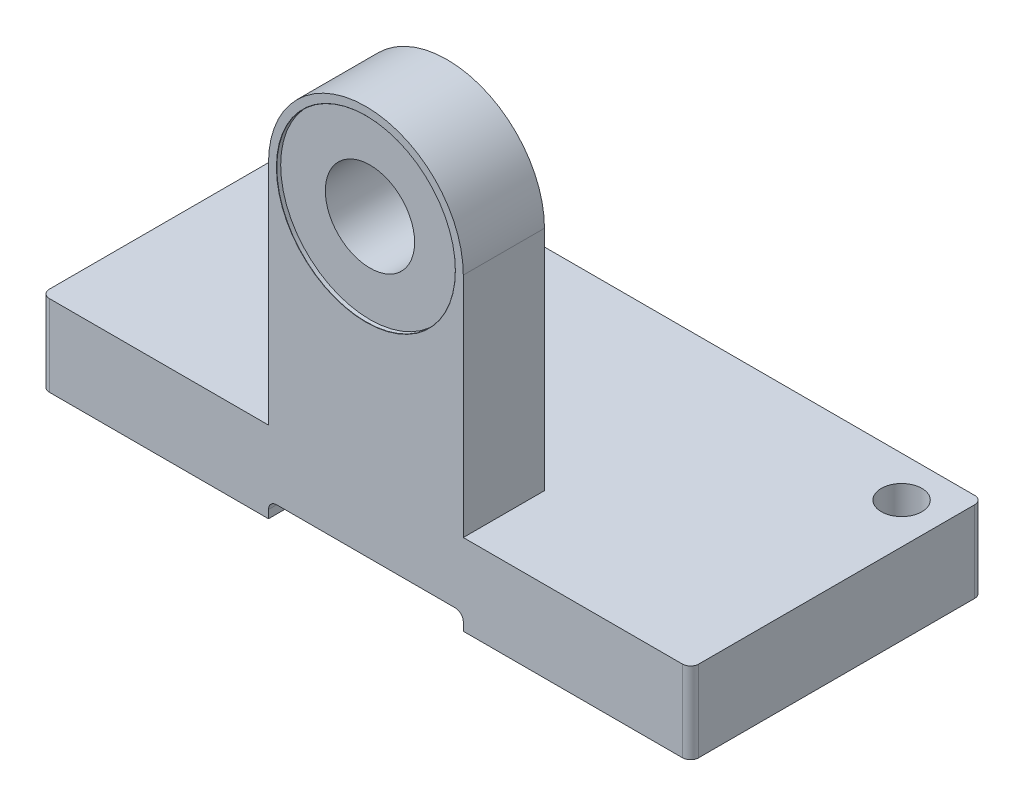
ISO-10303-21;
HEADER;
FILE_DESCRIPTION(('STEP AP214'),'2;1');
FILE_NAME('part.step','',(''),(''),'','','');
FILE_SCHEMA(('AUTOMOTIVE_DESIGN { 1 0 10303 214 1 1 1 1 }'));
ENDSEC;
DATA;
#1=APPLICATION_CONTEXT('core data for automotive mechanical design processes');
#2=APPLICATION_PROTOCOL_DEFINITION('international standard','automotive_design',2000,#1);
#3=PRODUCT_CONTEXT('',#1,'mechanical');
#4=PRODUCT('Part','Part','',(#3));
#5=PRODUCT_RELATED_PRODUCT_CATEGORY('part','',(#4));
#6=PRODUCT_DEFINITION_FORMATION('','',#4);
#7=PRODUCT_DEFINITION_CONTEXT('part definition',#1,'design');
#8=PRODUCT_DEFINITION('design','',#6,#7);
#9=PRODUCT_DEFINITION_SHAPE('','',#8);
#10=(LENGTH_UNIT() NAMED_UNIT(*) SI_UNIT(.MILLI.,.METRE.));
#11=(NAMED_UNIT(*) PLANE_ANGLE_UNIT() SI_UNIT($,.RADIAN.));
#12=(NAMED_UNIT(*) SI_UNIT($,.STERADIAN.) SOLID_ANGLE_UNIT());
#13=UNCERTAINTY_MEASURE_WITH_UNIT(LENGTH_MEASURE(1.E-05),#10,'distance_accuracy_value','');
#14=(GEOMETRIC_REPRESENTATION_CONTEXT(3) GLOBAL_UNCERTAINTY_ASSIGNED_CONTEXT((#13)) GLOBAL_UNIT_ASSIGNED_CONTEXT((#10,
#11,#12)) REPRESENTATION_CONTEXT('',''));
#15=CARTESIAN_POINT('',(0.,0.,0.));
#16=DIRECTION('',(0.,0.,1.));
#17=DIRECTION('',(1.,0.,0.));
#18=AXIS2_PLACEMENT_3D('',#15,#16,#17);
#19=CARTESIAN_POINT('',(0.,-10.,-36.));
#20=DIRECTION('',(0.,-1.,0.));
#21=DIRECTION('',(0.,0.,-1.));
#22=AXIS2_PLACEMENT_3D('',#19,#20,#21);
#23=PLANE('',#22);
#24=CARTESIAN_POINT('',(5.,-10.,-31.));
#25=DIRECTION('',(0.,1.,0.));
#26=DIRECTION('',(0.,0.,1.));
#27=AXIS2_PLACEMENT_3D('',#24,#25,#26);
#28=CIRCLE('',#27,2.5);
#29=CARTESIAN_POINT('',(5.,-10.,-28.5));
#30=VERTEX_POINT('',#29);
#31=EDGE_CURVE('E470',#30,#30,#28,.T.);
#32=ORIENTED_EDGE('',*,*,#31,.T.);
#33=EDGE_LOOP('',(#32));
#34=FACE_BOUND('',#33,.T.);
#35=DIRECTION('',(0.,0.,1.));
#36=VECTOR('',#35,1.);
#37=CARTESIAN_POINT('',(0.,-10.,-36.));
#38=LINE('',#37,#36);
#39=CARTESIAN_POINT('',(0.,-10.,-35.));
#40=VERTEX_POINT('',#39);
#41=CARTESIAN_POINT('',(0.,-10.,-1.));
#42=VERTEX_POINT('',#41);
#43=EDGE_CURVE('E238',#40,#42,#38,.T.);
#44=ORIENTED_EDGE('',*,*,#43,.F.);
#45=CARTESIAN_POINT('',(1.,-10.,-35.));
#46=DIRECTION('',(0.,-1.,0.));
#47=DIRECTION('',(0.,0.,-1.));
#48=AXIS2_PLACEMENT_3D('',#45,#46,#47);
#49=CIRCLE('',#48,1.);
#50=CARTESIAN_POINT('',(1.,-10.,-36.));
#51=VERTEX_POINT('',#50);
#52=EDGE_CURVE('E190',#40,#51,#49,.T.);
#53=ORIENTED_EDGE('',*,*,#52,.T.);
#54=DIRECTION('',(1.,0.,0.));
#55=VECTOR('',#54,1.);
#56=CARTESIAN_POINT('',(0.,-10.,-36.));
#57=LINE('',#56,#55);
#58=CARTESIAN_POINT('',(28.,-10.,-36.));
#59=VERTEX_POINT('',#58);
#60=EDGE_CURVE('E172',#51,#59,#57,.T.);
#61=ORIENTED_EDGE('',*,*,#60,.T.);
#62=DIRECTION('',(0.,0.,1.));
#63=VECTOR('',#62,1.);
#64=CARTESIAN_POINT('',(28.,-10.,-36.));
#65=LINE('',#64,#63);
#66=CARTESIAN_POINT('',(28.,-10.,0.));
#67=VERTEX_POINT('',#66);
#68=EDGE_CURVE('E189',#59,#67,#65,.T.);
#69=ORIENTED_EDGE('',*,*,#68,.T.);
#70=DIRECTION('',(1.,0.,0.));
#71=VECTOR('',#70,1.);
#72=CARTESIAN_POINT('',(0.,-10.,0.));
#73=LINE('',#72,#71);
#74=CARTESIAN_POINT('',(1.,-10.,0.));
#75=VERTEX_POINT('',#74);
#76=EDGE_CURVE('E239',#75,#67,#73,.T.);
#77=ORIENTED_EDGE('',*,*,#76,.F.);
#78=CARTESIAN_POINT('',(1.,-10.,-1.));
#79=DIRECTION('',(0.,-1.,0.));
#80=DIRECTION('',(0.,0.,-1.));
#81=AXIS2_PLACEMENT_3D('',#78,#79,#80);
#82=CIRCLE('',#81,1.);
#83=EDGE_CURVE('E287',#75,#42,#82,.T.);
#84=ORIENTED_EDGE('',*,*,#83,.T.);
#85=EDGE_LOOP('',(#44,#53,#61,#69,#77,#84));
#86=FACE_BOUND('',#85,.T.);
#87=ADVANCED_FACE('F45',(#34,#86),#23,.T.);
#88=CARTESIAN_POINT('',(40.,28.,-10.));
#89=DIRECTION('',(0.,0.,1.));
#90=DIRECTION('',(1.,0.,0.));
#91=AXIS2_PLACEMENT_3D('',#88,#89,#90);
#92=CYLINDRICAL_SURFACE('',#91,12.);
#93=DIRECTION('',(0.,0.,1.));
#94=VECTOR('',#93,1.);
#95=CARTESIAN_POINT('',(52.,28.,-10.));
#96=LINE('',#95,#94);
#97=CARTESIAN_POINT('',(52.,28.,-10.));
#98=VERTEX_POINT('',#97);
#99=CARTESIAN_POINT('',(52.,28.,0.));
#100=VERTEX_POINT('',#99);
#101=EDGE_CURVE('E250',#98,#100,#96,.T.);
#102=ORIENTED_EDGE('',*,*,#101,.F.);
#103=CARTESIAN_POINT('',(40.,28.,-10.));
#104=DIRECTION('',(0.,0.,1.));
#105=DIRECTION('',(1.,0.,0.));
#106=AXIS2_PLACEMENT_3D('',#103,#104,#105);
#107=CIRCLE('',#106,12.);
#108=CARTESIAN_POINT('',(28.,28.,-10.));
#109=VERTEX_POINT('',#108);
#110=EDGE_CURVE('E269',#109,#98,#107,.F.);
#111=ORIENTED_EDGE('',*,*,#110,.F.);
#112=DIRECTION('',(0.,0.,1.));
#113=VECTOR('',#112,1.);
#114=CARTESIAN_POINT('',(28.,28.,-10.));
#115=LINE('',#114,#113);
#116=CARTESIAN_POINT('',(28.,28.,0.));
#117=VERTEX_POINT('',#116);
#118=EDGE_CURVE('E265',#117,#109,#115,.F.);
#119=ORIENTED_EDGE('',*,*,#118,.F.);
#120=CARTESIAN_POINT('',(40.,28.,0.));
#121=DIRECTION('',(0.,0.,1.));
#122=DIRECTION('',(1.,0.,0.));
#123=AXIS2_PLACEMENT_3D('',#120,#121,#122);
#124=CIRCLE('',#123,12.);
#125=EDGE_CURVE('E272',#100,#117,#124,.T.);
#126=ORIENTED_EDGE('',*,*,#125,.F.);
#127=EDGE_LOOP('',(#102,#111,#119,#126));
#128=FACE_BOUND('',#127,.T.);
#129=ADVANCED_FACE('F406',(#128),#92,.T.);
#130=CARTESIAN_POINT('',(0.,0.,-36.));
#131=DIRECTION('',(-1.,0.,0.));
#132=DIRECTION('',(0.,-1.,0.));
#133=AXIS2_PLACEMENT_3D('',#130,#131,#132);
#134=PLANE('',#133);
#135=DIRECTION('',(0.,0.,1.));
#136=VECTOR('',#135,1.);
#137=CARTESIAN_POINT('',(0.,0.,-36.));
#138=LINE('',#137,#136);
#139=CARTESIAN_POINT('',(0.,0.,-35.));
#140=VERTEX_POINT('',#139);
#141=CARTESIAN_POINT('',(0.,0.,-1.));
#142=VERTEX_POINT('',#141);
#143=EDGE_CURVE('E246',#140,#142,#138,.T.);
#144=ORIENTED_EDGE('',*,*,#143,.F.);
#145=DIRECTION('',(0.,-1.,0.));
#146=VECTOR('',#145,1.);
#147=CARTESIAN_POINT('',(0.,-10.,-35.));
#148=LINE('',#147,#146);
#149=EDGE_CURVE('E283',#140,#40,#148,.T.);
#150=ORIENTED_EDGE('',*,*,#149,.T.);
#151=ORIENTED_EDGE('',*,*,#43,.T.);
#152=DIRECTION('',(0.,-1.,0.));
#153=VECTOR('',#152,1.);
#154=CARTESIAN_POINT('',(0.,0.,-1.));
#155=LINE('',#154,#153);
#156=EDGE_CURVE('E275',#42,#142,#155,.F.);
#157=ORIENTED_EDGE('',*,*,#156,.T.);
#158=EDGE_LOOP('',(#144,#150,#151,#157));
#159=FACE_BOUND('',#158,.T.);
#160=ADVANCED_FACE('F385',(#159),#134,.T.);
#161=CARTESIAN_POINT('',(0.,0.,-36.));
#162=DIRECTION('',(0.,1.,0.));
#163=DIRECTION('',(0.,0.,1.));
#164=AXIS2_PLACEMENT_3D('',#161,#162,#163);
#165=PLANE('',#164);
#166=CARTESIAN_POINT('',(75.,0.,-31.));
#167=DIRECTION('',(0.,1.,0.));
#168=DIRECTION('',(0.,0.,1.));
#169=AXIS2_PLACEMENT_3D('',#166,#167,#168);
#170=CIRCLE('',#169,2.49999999999999);
#171=CARTESIAN_POINT('',(75.,0.,-28.5));
#172=VERTEX_POINT('',#171);
#173=EDGE_CURVE('E478',#172,#172,#170,.T.);
#174=ORIENTED_EDGE('',*,*,#173,.F.);
#175=EDGE_LOOP('',(#174));
#176=FACE_BOUND('',#175,.T.);
#177=CARTESIAN_POINT('',(5.,0.,-31.));
#178=DIRECTION('',(0.,1.,0.));
#179=DIRECTION('',(0.,0.,1.));
#180=AXIS2_PLACEMENT_3D('',#177,#178,#179);
#181=CIRCLE('',#180,2.5);
#182=CARTESIAN_POINT('',(5.,0.,-28.5));
#183=VERTEX_POINT('',#182);
#184=EDGE_CURVE('E474',#183,#183,#181,.T.);
#185=ORIENTED_EDGE('',*,*,#184,.F.);
#186=EDGE_LOOP('',(#185));
#187=FACE_BOUND('',#186,.T.);
#188=DIRECTION('',(-1.,0.,0.));
#189=VECTOR('',#188,1.);
#190=CARTESIAN_POINT('',(0.,0.,-36.));
#191=LINE('',#190,#189);
#192=CARTESIAN_POINT('',(79.,0.,-36.));
#193=VERTEX_POINT('',#192);
#194=CARTESIAN_POINT('',(1.,0.,-36.));
#195=VERTEX_POINT('',#194);
#196=EDGE_CURVE('E192',#193,#195,#191,.T.);
#197=ORIENTED_EDGE('',*,*,#196,.T.);
#198=CARTESIAN_POINT('',(1.,0.,-35.));
#199=DIRECTION('',(0.,1.,0.));
#200=DIRECTION('',(0.,0.,1.));
#201=AXIS2_PLACEMENT_3D('',#198,#199,#200);
#202=CIRCLE('',#201,1.);
#203=EDGE_CURVE('E307',#195,#140,#202,.T.);
#204=ORIENTED_EDGE('',*,*,#203,.T.);
#205=ORIENTED_EDGE('',*,*,#143,.T.);
#206=CARTESIAN_POINT('',(1.,0.,-1.));
#207=DIRECTION('',(0.,1.,0.));
#208=DIRECTION('',(0.,0.,1.));
#209=AXIS2_PLACEMENT_3D('',#206,#207,#208);
#210=CIRCLE('',#209,1.);
#211=CARTESIAN_POINT('',(1.,0.,0.));
#212=VERTEX_POINT('',#211);
#213=EDGE_CURVE('E298',#142,#212,#210,.T.);
#214=ORIENTED_EDGE('',*,*,#213,.T.);
#215=DIRECTION('',(-1.,0.,0.));
#216=VECTOR('',#215,1.);
#217=CARTESIAN_POINT('',(0.,0.,0.));
#218=LINE('',#217,#216);
#219=CARTESIAN_POINT('',(28.,0.,0.));
#220=VERTEX_POINT('',#219);
#221=EDGE_CURVE('E242',#220,#212,#218,.T.);
#222=ORIENTED_EDGE('',*,*,#221,.F.);
#223=DIRECTION('',(0.,0.,1.));
#224=VECTOR('',#223,1.);
#225=CARTESIAN_POINT('',(28.,0.,-10.));
#226=LINE('',#225,#224);
#227=CARTESIAN_POINT('',(28.,0.,-10.));
#228=VERTEX_POINT('',#227);
#229=EDGE_CURVE('E223',#228,#220,#226,.T.);
#230=ORIENTED_EDGE('',*,*,#229,.F.);
#231=DIRECTION('',(1.,0.,0.));
#232=VECTOR('',#231,1.);
#233=CARTESIAN_POINT('',(0.,0.,-10.));
#234=LINE('',#233,#232);
#235=CARTESIAN_POINT('',(52.,0.,-10.));
#236=VERTEX_POINT('',#235);
#237=EDGE_CURVE('E227',#228,#236,#234,.T.);
#238=ORIENTED_EDGE('',*,*,#237,.T.);
#239=DIRECTION('',(0.,0.,1.));
#240=VECTOR('',#239,1.);
#241=CARTESIAN_POINT('',(52.,0.,-10.));
#242=LINE('',#241,#240);
#243=CARTESIAN_POINT('',(52.,0.,0.));
#244=VERTEX_POINT('',#243);
#245=EDGE_CURVE('E217',#236,#244,#242,.T.);
#246=ORIENTED_EDGE('',*,*,#245,.T.);
#247=CARTESIAN_POINT('',(79.,0.,0.));
#248=VERTEX_POINT('',#247);
#249=EDGE_CURVE('E243',#248,#244,#218,.T.);
#250=ORIENTED_EDGE('',*,*,#249,.F.);
#251=CARTESIAN_POINT('',(79.,0.,-1.));
#252=DIRECTION('',(0.,1.,0.));
#253=DIRECTION('',(0.,0.,1.));
#254=AXIS2_PLACEMENT_3D('',#251,#252,#253);
#255=CIRCLE('',#254,1.);
#256=CARTESIAN_POINT('',(80.,0.,-1.));
#257=VERTEX_POINT('',#256);
#258=EDGE_CURVE('E301',#248,#257,#255,.T.);
#259=ORIENTED_EDGE('',*,*,#258,.T.);
#260=DIRECTION('',(0.,0.,1.));
#261=VECTOR('',#260,1.);
#262=CARTESIAN_POINT('',(80.,0.,-36.));
#263=LINE('',#262,#261);
#264=CARTESIAN_POINT('',(80.,0.,-35.));
#265=VERTEX_POINT('',#264);
#266=EDGE_CURVE('E251',#265,#257,#263,.T.);
#267=ORIENTED_EDGE('',*,*,#266,.F.);
#268=CARTESIAN_POINT('',(79.,0.,-35.));
#269=DIRECTION('',(0.,1.,0.));
#270=DIRECTION('',(0.,0.,1.));
#271=AXIS2_PLACEMENT_3D('',#268,#269,#270);
#272=CIRCLE('',#271,1.);
#273=EDGE_CURVE('E304',#265,#193,#272,.T.);
#274=ORIENTED_EDGE('',*,*,#273,.T.);
#275=EDGE_LOOP('',(#197,#204,#205,#214,#222,#230,#238,#246,#250,#259,#267,#274));
#276=FACE_BOUND('',#275,.T.);
#277=ADVANCED_FACE('F367',(#176,#187,#276),#165,.T.);
#278=CARTESIAN_POINT('',(80.,0.,-36.));
#279=DIRECTION('',(1.,0.,0.));
#280=DIRECTION('',(0.,0.,-1.));
#281=AXIS2_PLACEMENT_3D('',#278,#279,#280);
#282=PLANE('',#281);
#283=DIRECTION('',(0.,0.,1.));
#284=VECTOR('',#283,1.);
#285=CARTESIAN_POINT('',(80.,-10.,-36.));
#286=LINE('',#285,#284);
#287=CARTESIAN_POINT('',(80.,-10.,-35.));
#288=VERTEX_POINT('',#287);
#289=CARTESIAN_POINT('',(80.,-10.,-1.));
#290=VERTEX_POINT('',#289);
#291=EDGE_CURVE('E255',#288,#290,#286,.T.);
#292=ORIENTED_EDGE('',*,*,#291,.F.);
#293=DIRECTION('',(0.,1.,0.));
#294=VECTOR('',#293,1.);
#295=CARTESIAN_POINT('',(80.,0.,-35.));
#296=LINE('',#295,#294);
#297=EDGE_CURVE('E313',#288,#265,#296,.T.);
#298=ORIENTED_EDGE('',*,*,#297,.T.);
#299=ORIENTED_EDGE('',*,*,#266,.T.);
#300=DIRECTION('',(0.,1.,0.));
#301=VECTOR('',#300,1.);
#302=CARTESIAN_POINT('',(80.,0.,-1.));
#303=LINE('',#302,#301);
#304=EDGE_CURVE('E310',#257,#290,#303,.F.);
#305=ORIENTED_EDGE('',*,*,#304,.T.);
#306=EDGE_LOOP('',(#292,#298,#299,#305));
#307=FACE_BOUND('',#306,.T.);
#308=ADVANCED_FACE('F370',(#307),#282,.T.);
#309=CARTESIAN_POINT('',(75.,-10.,-31.));
#310=DIRECTION('',(0.,1.,0.));
#311=DIRECTION('',(0.,0.,1.));
#312=AXIS2_PLACEMENT_3D('',#309,#310,#311);
#313=CIRCLE('',#312,2.49999999999999);
#314=CARTESIAN_POINT('',(75.,-10.,-28.5));
#315=VERTEX_POINT('',#314);
#316=EDGE_CURVE('E469',#315,#315,#313,.T.);
#317=ORIENTED_EDGE('',*,*,#316,.T.);
#318=EDGE_LOOP('',(#317));
#319=FACE_BOUND('',#318,.T.);
#320=CARTESIAN_POINT('',(52.,-10.,-36.));
#321=VERTEX_POINT('',#320);
#322=CARTESIAN_POINT('',(79.,-10.,-36.));
#323=VERTEX_POINT('',#322);
#324=EDGE_CURVE('E193',#321,#323,#57,.T.);
#325=ORIENTED_EDGE('',*,*,#324,.T.);
#326=CARTESIAN_POINT('',(79.,-10.,-35.));
#327=DIRECTION('',(0.,-1.,0.));
#328=DIRECTION('',(0.,0.,-1.));
#329=AXIS2_PLACEMENT_3D('',#326,#327,#328);
#330=CIRCLE('',#329,1.);
#331=EDGE_CURVE('E320',#323,#288,#330,.T.);
#332=ORIENTED_EDGE('',*,*,#331,.T.);
#333=ORIENTED_EDGE('',*,*,#291,.T.);
#334=CARTESIAN_POINT('',(79.,-10.,-1.));
#335=DIRECTION('',(0.,-1.,0.));
#336=DIRECTION('',(0.,0.,-1.));
#337=AXIS2_PLACEMENT_3D('',#334,#335,#336);
#338=CIRCLE('',#337,1.);
#339=CARTESIAN_POINT('',(79.,-10.,0.));
#340=VERTEX_POINT('',#339);
#341=EDGE_CURVE('E317',#290,#340,#338,.T.);
#342=ORIENTED_EDGE('',*,*,#341,.T.);
#343=CARTESIAN_POINT('',(52.,-10.,0.));
#344=VERTEX_POINT('',#343);
#345=EDGE_CURVE('E233',#344,#340,#73,.T.);
#346=ORIENTED_EDGE('',*,*,#345,.F.);
#347=DIRECTION('',(0.,0.,1.));
#348=VECTOR('',#347,1.);
#349=CARTESIAN_POINT('',(52.,-10.,-36.));
#350=LINE('',#349,#348);
#351=EDGE_CURVE('E199',#321,#344,#350,.T.);
#352=ORIENTED_EDGE('',*,*,#351,.F.);
#353=EDGE_LOOP('',(#325,#332,#333,#342,#346,#352));
#354=FACE_BOUND('',#353,.T.);
#355=ADVANCED_FACE('F416',(#319,#354),#23,.T.);
#356=CARTESIAN_POINT('',(0.,0.,-36.));
#357=DIRECTION('',(0.,0.,1.));
#358=DIRECTION('',(1.,0.,0.));
#359=AXIS2_PLACEMENT_3D('',#356,#357,#358);
#360=PLANE('',#359);
#361=ORIENTED_EDGE('',*,*,#60,.F.);
#362=DIRECTION('',(0.,-1.,0.));
#363=VECTOR('',#362,1.);
#364=CARTESIAN_POINT('',(1.,0.,-36.));
#365=LINE('',#364,#363);
#366=EDGE_CURVE('E295',#51,#195,#365,.F.);
#367=ORIENTED_EDGE('',*,*,#366,.T.);
#368=ORIENTED_EDGE('',*,*,#196,.F.);
#369=DIRECTION('',(0.,1.,0.));
#370=VECTOR('',#369,1.);
#371=CARTESIAN_POINT('',(79.,-10.,-36.));
#372=LINE('',#371,#370);
#373=EDGE_CURVE('E292',#193,#323,#372,.F.);
#374=ORIENTED_EDGE('',*,*,#373,.T.);
#375=ORIENTED_EDGE('',*,*,#324,.F.);
#376=DIRECTION('',(0.,1.,0.));
#377=VECTOR('',#376,1.);
#378=CARTESIAN_POINT('',(52.,-10.,-36.));
#379=LINE('',#378,#377);
#380=CARTESIAN_POINT('',(52.,-9.,-36.));
#381=VERTEX_POINT('',#380);
#382=EDGE_CURVE('E182',#321,#381,#379,.T.);
#383=ORIENTED_EDGE('',*,*,#382,.T.);
#384=CARTESIAN_POINT('',(51.,-9.,-36.));
#385=DIRECTION('',(0.,0.,1.));
#386=DIRECTION('',(1.,0.,0.));
#387=AXIS2_PLACEMENT_3D('',#384,#385,#386);
#388=CIRCLE('',#387,1.);
#389=CARTESIAN_POINT('',(51.,-8.,-36.));
#390=VERTEX_POINT('',#389);
#391=EDGE_CURVE('E11',#381,#390,#388,.T.);
#392=ORIENTED_EDGE('',*,*,#391,.T.);
#393=DIRECTION('',(-1.,0.,0.));
#394=VECTOR('',#393,1.);
#395=CARTESIAN_POINT('',(28.,-8.,-36.));
#396=LINE('',#395,#394);
#397=CARTESIAN_POINT('',(29.,-8.,-36.));
#398=VERTEX_POINT('',#397);
#399=EDGE_CURVE('E200',#390,#398,#396,.T.);
#400=ORIENTED_EDGE('',*,*,#399,.T.);
#401=CARTESIAN_POINT('',(29.,-9.,-36.));
#402=DIRECTION('',(0.,0.,1.));
#403=DIRECTION('',(1.,0.,0.));
#404=AXIS2_PLACEMENT_3D('',#401,#402,#403);
#405=CIRCLE('',#404,1.);
#406=CARTESIAN_POINT('',(28.,-9.,-36.));
#407=VERTEX_POINT('',#406);
#408=EDGE_CURVE('E176',#398,#407,#405,.T.);
#409=ORIENTED_EDGE('',*,*,#408,.T.);
#410=DIRECTION('',(0.,-1.,0.));
#411=VECTOR('',#410,1.);
#412=CARTESIAN_POINT('',(28.,-10.,-36.));
#413=LINE('',#412,#411);
#414=EDGE_CURVE('E169',#407,#59,#413,.T.);
#415=ORIENTED_EDGE('',*,*,#414,.T.);
#416=EDGE_LOOP('',(#361,#367,#368,#374,#375,#383,#392,#400,#409,#415));
#417=FACE_BOUND('',#416,.T.);
#418=ADVANCED_FACE('F171',(#417),#360,.F.);
#419=CARTESIAN_POINT('',(0.,0.,0.));
#420=DIRECTION('',(0.,0.,1.));
#421=DIRECTION('',(1.,0.,0.));
#422=AXIS2_PLACEMENT_3D('',#419,#420,#421);
#423=PLANE('',#422);
#424=CARTESIAN_POINT('',(40.,28.,0.));
#425=DIRECTION('',(0.,0.,1.));
#426=DIRECTION('',(1.,0.,0.));
#427=AXIS2_PLACEMENT_3D('',#424,#425,#426);
#428=CIRCLE('',#427,11.025);
#429=CARTESIAN_POINT('',(51.025,28.,0.));
#430=VERTEX_POINT('',#429);
#431=EDGE_CURVE('E465',#430,#430,#428,.T.);
#432=ORIENTED_EDGE('',*,*,#431,.F.);
#433=EDGE_LOOP('',(#432));
#434=FACE_BOUND('',#433,.T.);
#435=ORIENTED_EDGE('',*,*,#345,.T.);
#436=DIRECTION('',(0.,1.,0.));
#437=VECTOR('',#436,1.);
#438=CARTESIAN_POINT('',(79.,0.,0.));
#439=LINE('',#438,#437);
#440=EDGE_CURVE('E327',#340,#248,#439,.T.);
#441=ORIENTED_EDGE('',*,*,#440,.T.);
#442=ORIENTED_EDGE('',*,*,#249,.T.);
#443=DIRECTION('',(0.,1.,0.));
#444=VECTOR('',#443,1.);
#445=CARTESIAN_POINT('',(52.,40.,0.));
#446=LINE('',#445,#444);
#447=EDGE_CURVE('E204',#244,#100,#446,.T.);
#448=ORIENTED_EDGE('',*,*,#447,.T.);
#449=ORIENTED_EDGE('',*,*,#125,.T.);
#450=DIRECTION('',(0.,-1.,0.));
#451=VECTOR('',#450,1.);
#452=CARTESIAN_POINT('',(28.,0.,0.));
#453=LINE('',#452,#451);
#454=EDGE_CURVE('E214',#117,#220,#453,.T.);
#455=ORIENTED_EDGE('',*,*,#454,.T.);
#456=ORIENTED_EDGE('',*,*,#221,.T.);
#457=DIRECTION('',(0.,-1.,0.));
#458=VECTOR('',#457,1.);
#459=CARTESIAN_POINT('',(1.,0.,0.));
#460=LINE('',#459,#458);
#461=EDGE_CURVE('E323',#212,#75,#460,.T.);
#462=ORIENTED_EDGE('',*,*,#461,.T.);
#463=ORIENTED_EDGE('',*,*,#76,.T.);
#464=DIRECTION('',(0.,-1.,0.));
#465=VECTOR('',#464,1.);
#466=CARTESIAN_POINT('',(28.,-10.,0.));
#467=LINE('',#466,#465);
#468=CARTESIAN_POINT('',(28.,-9.,0.));
#469=VERTEX_POINT('',#468);
#470=EDGE_CURVE('E196',#469,#67,#467,.T.);
#471=ORIENTED_EDGE('',*,*,#470,.F.);
#472=CARTESIAN_POINT('',(29.,-9.,0.));
#473=DIRECTION('',(0.,0.,1.));
#474=DIRECTION('',(1.,0.,0.));
#475=AXIS2_PLACEMENT_3D('',#472,#473,#474);
#476=CIRCLE('',#475,1.);
#477=CARTESIAN_POINT('',(29.,-8.,0.));
#478=VERTEX_POINT('',#477);
#479=EDGE_CURVE('E66',#469,#478,#476,.F.);
#480=ORIENTED_EDGE('',*,*,#479,.T.);
#481=DIRECTION('',(-1.,0.,0.));
#482=VECTOR('',#481,1.);
#483=CARTESIAN_POINT('',(28.,-8.,0.));
#484=LINE('',#483,#482);
#485=CARTESIAN_POINT('',(51.,-8.,0.));
#486=VERTEX_POINT('',#485);
#487=EDGE_CURVE('E183',#486,#478,#484,.T.);
#488=ORIENTED_EDGE('',*,*,#487,.F.);
#489=CARTESIAN_POINT('',(51.,-9.,0.));
#490=DIRECTION('',(0.,0.,1.));
#491=DIRECTION('',(1.,0.,0.));
#492=AXIS2_PLACEMENT_3D('',#489,#490,#491);
#493=CIRCLE('',#492,1.);
#494=CARTESIAN_POINT('',(52.,-9.,0.));
#495=VERTEX_POINT('',#494);
#496=EDGE_CURVE('E54',#486,#495,#493,.F.);
#497=ORIENTED_EDGE('',*,*,#496,.T.);
#498=DIRECTION('',(0.,1.,0.));
#499=VECTOR('',#498,1.);
#500=CARTESIAN_POINT('',(52.,-10.,0.));
#501=LINE('',#500,#499);
#502=EDGE_CURVE('E358',#344,#495,#501,.T.);
#503=ORIENTED_EDGE('',*,*,#502,.F.);
#504=EDGE_LOOP('',(#435,#441,#442,#448,#449,#455,#456,#462,#463,#471,#480,#488,#497,#503));
#505=FACE_BOUND('',#504,.T.);
#506=ADVANCED_FACE('F356',(#434,#505),#423,.T.);
#507=CARTESIAN_POINT('',(28.,0.,-10.));
#508=DIRECTION('',(-1.,0.,0.));
#509=DIRECTION('',(0.,0.,1.));
#510=AXIS2_PLACEMENT_3D('',#507,#508,#509);
#511=PLANE('',#510);
#512=ORIENTED_EDGE('',*,*,#454,.F.);
#513=ORIENTED_EDGE('',*,*,#118,.T.);
#514=DIRECTION('',(0.,-1.,0.));
#515=VECTOR('',#514,1.);
#516=CARTESIAN_POINT('',(28.,0.,-10.));
#517=LINE('',#516,#515);
#518=EDGE_CURVE('E213',#109,#228,#517,.T.);
#519=ORIENTED_EDGE('',*,*,#518,.T.);
#520=ORIENTED_EDGE('',*,*,#229,.T.);
#521=EDGE_LOOP('',(#512,#513,#519,#520));
#522=FACE_BOUND('',#521,.T.);
#523=ADVANCED_FACE('F395',(#522),#511,.T.);
#524=CARTESIAN_POINT('',(52.,40.,-10.));
#525=DIRECTION('',(1.,0.,0.));
#526=DIRECTION('',(0.,1.,0.));
#527=AXIS2_PLACEMENT_3D('',#524,#525,#526);
#528=PLANE('',#527);
#529=DIRECTION('',(0.,1.,0.));
#530=VECTOR('',#529,1.);
#531=CARTESIAN_POINT('',(52.,40.,-10.));
#532=LINE('',#531,#530);
#533=EDGE_CURVE('E209',#236,#98,#532,.T.);
#534=ORIENTED_EDGE('',*,*,#533,.T.);
#535=ORIENTED_EDGE('',*,*,#101,.T.);
#536=ORIENTED_EDGE('',*,*,#447,.F.);
#537=ORIENTED_EDGE('',*,*,#245,.F.);
#538=EDGE_LOOP('',(#534,#535,#536,#537));
#539=FACE_BOUND('',#538,.T.);
#540=ADVANCED_FACE('F403',(#539),#528,.T.);
#541=CARTESIAN_POINT('',(0.,0.,-10.));
#542=DIRECTION('',(0.,0.,1.));
#543=DIRECTION('',(1.,0.,0.));
#544=AXIS2_PLACEMENT_3D('',#541,#542,#543);
#545=PLANE('',#544);
#546=CARTESIAN_POINT('',(40.,28.,-10.));
#547=DIRECTION('',(0.,0.,1.));
#548=DIRECTION('',(1.,0.,0.));
#549=AXIS2_PLACEMENT_3D('',#546,#547,#548);
#550=CIRCLE('',#549,5.49999999999999);
#551=CARTESIAN_POINT('',(45.5,28.,-10.));
#552=VERTEX_POINT('',#551);
#553=EDGE_CURVE('E276',#552,#552,#550,.T.);
#554=ORIENTED_EDGE('',*,*,#553,.T.);
#555=EDGE_LOOP('',(#554));
#556=FACE_BOUND('',#555,.T.);
#557=ORIENTED_EDGE('',*,*,#518,.F.);
#558=ORIENTED_EDGE('',*,*,#110,.T.);
#559=ORIENTED_EDGE('',*,*,#533,.F.);
#560=ORIENTED_EDGE('',*,*,#237,.F.);
#561=EDGE_LOOP('',(#557,#558,#559,#560));
#562=FACE_BOUND('',#561,.T.);
#563=ADVANCED_FACE('F400',(#556,#562),#545,.F.);
#564=CARTESIAN_POINT('',(28.,-10.,-36.));
#565=DIRECTION('',(-1.,0.,0.));
#566=DIRECTION('',(0.,-1.,0.));
#567=AXIS2_PLACEMENT_3D('',#564,#565,#566);
#568=PLANE('',#567);
#569=ORIENTED_EDGE('',*,*,#414,.F.);
#570=DIRECTION('',(0.,0.,1.));
#571=VECTOR('',#570,1.);
#572=CARTESIAN_POINT('',(28.,-9.,0.));
#573=LINE('',#572,#571);
#574=EDGE_CURVE('E331',#407,#469,#573,.T.);
#575=ORIENTED_EDGE('',*,*,#574,.T.);
#576=ORIENTED_EDGE('',*,*,#470,.T.);
#577=ORIENTED_EDGE('',*,*,#68,.F.);
#578=EDGE_LOOP('',(#569,#575,#576,#577));
#579=FACE_BOUND('',#578,.T.);
#580=ADVANCED_FACE('F195',(#579),#568,.F.);
#581=CARTESIAN_POINT('',(28.,-8.,-36.));
#582=DIRECTION('',(0.,1.,0.));
#583=DIRECTION('',(0.,0.,1.));
#584=AXIS2_PLACEMENT_3D('',#581,#582,#583);
#585=PLANE('',#584);
#586=ORIENTED_EDGE('',*,*,#487,.T.);
#587=DIRECTION('',(0.,0.,1.));
#588=VECTOR('',#587,1.);
#589=CARTESIAN_POINT('',(29.,-8.,-36.));
#590=LINE('',#589,#588);
#591=EDGE_CURVE('E338',#478,#398,#590,.F.);
#592=ORIENTED_EDGE('',*,*,#591,.T.);
#593=ORIENTED_EDGE('',*,*,#399,.F.);
#594=DIRECTION('',(0.,0.,1.));
#595=VECTOR('',#594,1.);
#596=CARTESIAN_POINT('',(51.,-8.,0.));
#597=LINE('',#596,#595);
#598=EDGE_CURVE('E334',#390,#486,#597,.T.);
#599=ORIENTED_EDGE('',*,*,#598,.T.);
#600=EDGE_LOOP('',(#586,#592,#593,#599));
#601=FACE_BOUND('',#600,.T.);
#602=ADVANCED_FACE('F444',(#601),#585,.F.);
#603=CARTESIAN_POINT('',(52.,-10.,-36.));
#604=DIRECTION('',(1.,0.,0.));
#605=DIRECTION('',(0.,0.,-1.));
#606=AXIS2_PLACEMENT_3D('',#603,#604,#605);
#607=PLANE('',#606);
#608=ORIENTED_EDGE('',*,*,#502,.T.);
#609=DIRECTION('',(0.,0.,1.));
#610=VECTOR('',#609,1.);
#611=CARTESIAN_POINT('',(52.,-9.,-36.));
#612=LINE('',#611,#610);
#613=EDGE_CURVE('E341',#495,#381,#612,.F.);
#614=ORIENTED_EDGE('',*,*,#613,.T.);
#615=ORIENTED_EDGE('',*,*,#382,.F.);
#616=ORIENTED_EDGE('',*,*,#351,.T.);
#617=EDGE_LOOP('',(#608,#614,#615,#616));
#618=FACE_BOUND('',#617,.T.);
#619=ADVANCED_FACE('F451',(#618),#607,.F.);
#620=CARTESIAN_POINT('',(40.,28.,0.));
#621=DIRECTION('',(0.,0.,1.));
#622=DIRECTION('',(1.,0.,0.));
#623=AXIS2_PLACEMENT_3D('',#620,#621,#622);
#624=CYLINDRICAL_SURFACE('',#623,5.49999999999999);
#625=CARTESIAN_POINT('',(40.,28.,-0.499999999999999));
#626=DIRECTION('',(0.,0.,1.));
#627=DIRECTION('',(1.,0.,0.));
#628=AXIS2_PLACEMENT_3D('',#625,#626,#627);
#629=CIRCLE('',#628,5.5);
#630=CARTESIAN_POINT('',(45.5,28.,-0.499999999999999));
#631=VERTEX_POINT('',#630);
#632=EDGE_CURVE('E280',#631,#631,#629,.T.);
#633=ORIENTED_EDGE('',*,*,#632,.T.);
#634=EDGE_LOOP('',(#633));
#635=FACE_BOUND('',#634,.T.);
#636=ORIENTED_EDGE('',*,*,#553,.F.);
#637=EDGE_LOOP('',(#636));
#638=FACE_BOUND('',#637,.T.);
#639=ADVANCED_FACE('F516',(#635,#638),#624,.F.);
#640=CARTESIAN_POINT('',(51.,28.,-0.499999999999999));
#641=DIRECTION('',(0.,0.,-1.));
#642=DIRECTION('',(-1.,0.,0.));
#643=AXIS2_PLACEMENT_3D('',#640,#641,#642);
#644=PLANE('',#643);
#645=ORIENTED_EDGE('',*,*,#632,.F.);
#646=EDGE_LOOP('',(#645));
#647=FACE_BOUND('',#646,.T.);
#648=CARTESIAN_POINT('',(40.,28.,-0.5));
#649=DIRECTION('',(0.,0.,1.));
#650=DIRECTION('',(1.,0.,0.));
#651=AXIS2_PLACEMENT_3D('',#648,#649,#650);
#652=CIRCLE('',#651,11.);
#653=CARTESIAN_POINT('',(51.,28.,-0.5));
#654=VERTEX_POINT('',#653);
#655=EDGE_CURVE('E457',#654,#654,#652,.T.);
#656=ORIENTED_EDGE('',*,*,#655,.T.);
#657=EDGE_LOOP('',(#656));
#658=FACE_BOUND('',#657,.T.);
#659=ADVANCED_FACE('F512',(#647,#658),#644,.F.);
#660=CARTESIAN_POINT('',(40.,28.,0.));
#661=DIRECTION('',(0.,0.,1.));
#662=DIRECTION('',(1.,0.,0.));
#663=AXIS2_PLACEMENT_3D('',#660,#661,#662);
#664=CYLINDRICAL_SURFACE('',#663,11.);
#665=ORIENTED_EDGE('',*,*,#655,.F.);
#666=EDGE_LOOP('',(#665));
#667=FACE_BOUND('',#666,.T.);
#668=CARTESIAN_POINT('',(40.,28.,-0.0209774907794322));
#669=DIRECTION('',(0.,0.,1.));
#670=DIRECTION('',(1.,0.,0.));
#671=AXIS2_PLACEMENT_3D('',#668,#669,#670);
#672=CIRCLE('',#671,11.);
#673=CARTESIAN_POINT('',(51.,28.,-0.0209774907794322));
#674=VERTEX_POINT('',#673);
#675=EDGE_CURVE('E461',#674,#674,#672,.T.);
#676=ORIENTED_EDGE('',*,*,#675,.T.);
#677=EDGE_LOOP('',(#676));
#678=FACE_BOUND('',#677,.T.);
#679=ADVANCED_FACE('F508',(#667,#678),#664,.F.);
#680=CARTESIAN_POINT('',(40.,28.,0.));
#681=DIRECTION('',(0.,0.,1.));
#682=DIRECTION('',(1.,0.,0.));
#683=AXIS2_PLACEMENT_3D('',#680,#681,#682);
#684=CONICAL_SURFACE('',#683,11.025,0.872664625997105);
#685=ORIENTED_EDGE('',*,*,#675,.F.);
#686=EDGE_LOOP('',(#685));
#687=FACE_BOUND('',#686,.T.);
#688=ORIENTED_EDGE('',*,*,#431,.T.);
#689=EDGE_LOOP('',(#688));
#690=FACE_BOUND('',#689,.T.);
#691=ADVANCED_FACE('F490',(#687,#690),#684,.F.);
#692=CARTESIAN_POINT('',(75.,-10.,-31.));
#693=DIRECTION('',(0.,1.,0.));
#694=DIRECTION('',(0.,0.,1.));
#695=AXIS2_PLACEMENT_3D('',#692,#693,#694);
#696=CYLINDRICAL_SURFACE('',#695,2.49999999999999);
#697=ORIENTED_EDGE('',*,*,#316,.F.);
#698=EDGE_LOOP('',(#697));
#699=FACE_BOUND('',#698,.T.);
#700=ORIENTED_EDGE('',*,*,#173,.T.);
#701=EDGE_LOOP('',(#700));
#702=FACE_BOUND('',#701,.T.);
#703=ADVANCED_FACE('F487',(#699,#702),#696,.F.);
#704=CARTESIAN_POINT('',(5.,-10.,-31.));
#705=DIRECTION('',(0.,1.,0.));
#706=DIRECTION('',(0.,0.,1.));
#707=AXIS2_PLACEMENT_3D('',#704,#705,#706);
#708=CYLINDRICAL_SURFACE('',#707,2.5);
#709=ORIENTED_EDGE('',*,*,#31,.F.);
#710=EDGE_LOOP('',(#709));
#711=FACE_BOUND('',#710,.T.);
#712=ORIENTED_EDGE('',*,*,#184,.T.);
#713=EDGE_LOOP('',(#712));
#714=FACE_BOUND('',#713,.T.);
#715=ADVANCED_FACE('F423',(#711,#714),#708,.F.);
#716=CARTESIAN_POINT('',(1.,0.,-35.));
#717=DIRECTION('',(0.,1.,0.));
#718=DIRECTION('',(-1.,0.,0.));
#719=AXIS2_PLACEMENT_3D('',#716,#717,#718);
#720=CYLINDRICAL_SURFACE('',#719,1.);
#721=ORIENTED_EDGE('',*,*,#203,.F.);
#722=ORIENTED_EDGE('',*,*,#366,.F.);
#723=ORIENTED_EDGE('',*,*,#52,.F.);
#724=ORIENTED_EDGE('',*,*,#149,.F.);
#725=EDGE_LOOP('',(#721,#722,#723,#724));
#726=FACE_BOUND('',#725,.T.);
#727=ADVANCED_FACE('F380',(#726),#720,.T.);
#728=CARTESIAN_POINT('',(79.,0.,-35.));
#729=DIRECTION('',(0.,-1.,0.));
#730=DIRECTION('',(0.,0.,-1.));
#731=AXIS2_PLACEMENT_3D('',#728,#729,#730);
#732=CYLINDRICAL_SURFACE('',#731,1.);
#733=ORIENTED_EDGE('',*,*,#331,.F.);
#734=ORIENTED_EDGE('',*,*,#373,.F.);
#735=ORIENTED_EDGE('',*,*,#273,.F.);
#736=ORIENTED_EDGE('',*,*,#297,.F.);
#737=EDGE_LOOP('',(#733,#734,#735,#736));
#738=FACE_BOUND('',#737,.T.);
#739=ADVANCED_FACE('F374',(#738),#732,.T.);
#740=CARTESIAN_POINT('',(79.,0.,-1.));
#741=DIRECTION('',(0.,1.,0.));
#742=DIRECTION('',(0.,0.,1.));
#743=AXIS2_PLACEMENT_3D('',#740,#741,#742);
#744=CYLINDRICAL_SURFACE('',#743,1.);
#745=ORIENTED_EDGE('',*,*,#341,.F.);
#746=ORIENTED_EDGE('',*,*,#304,.F.);
#747=ORIENTED_EDGE('',*,*,#258,.F.);
#748=ORIENTED_EDGE('',*,*,#440,.F.);
#749=EDGE_LOOP('',(#745,#746,#747,#748));
#750=FACE_BOUND('',#749,.T.);
#751=ADVANCED_FACE('F363',(#750),#744,.T.);
#752=CARTESIAN_POINT('',(1.,0.,-1.));
#753=DIRECTION('',(0.,-1.,0.));
#754=DIRECTION('',(1.,0.,0.));
#755=AXIS2_PLACEMENT_3D('',#752,#753,#754);
#756=CYLINDRICAL_SURFACE('',#755,1.);
#757=ORIENTED_EDGE('',*,*,#213,.F.);
#758=ORIENTED_EDGE('',*,*,#156,.F.);
#759=ORIENTED_EDGE('',*,*,#83,.F.);
#760=ORIENTED_EDGE('',*,*,#461,.F.);
#761=EDGE_LOOP('',(#757,#758,#759,#760));
#762=FACE_BOUND('',#761,.T.);
#763=ADVANCED_FACE('F388',(#762),#756,.T.);
#764=CARTESIAN_POINT('',(29.,-9.,-36.));
#765=DIRECTION('',(0.,0.,-1.));
#766=DIRECTION('',(-1.,0.,0.));
#767=AXIS2_PLACEMENT_3D('',#764,#765,#766);
#768=CYLINDRICAL_SURFACE('',#767,1.);
#769=ORIENTED_EDGE('',*,*,#408,.F.);
#770=ORIENTED_EDGE('',*,*,#591,.F.);
#771=ORIENTED_EDGE('',*,*,#479,.F.);
#772=ORIENTED_EDGE('',*,*,#574,.F.);
#773=EDGE_LOOP('',(#769,#770,#771,#772));
#774=FACE_BOUND('',#773,.T.);
#775=ADVANCED_FACE('F429',(#774),#768,.F.);
#776=CARTESIAN_POINT('',(51.,-9.,-36.));
#777=DIRECTION('',(0.,0.,-1.));
#778=DIRECTION('',(-1.,0.,0.));
#779=AXIS2_PLACEMENT_3D('',#776,#777,#778);
#780=CYLINDRICAL_SURFACE('',#779,1.);
#781=ORIENTED_EDGE('',*,*,#391,.F.);
#782=ORIENTED_EDGE('',*,*,#613,.F.);
#783=ORIENTED_EDGE('',*,*,#496,.F.);
#784=ORIENTED_EDGE('',*,*,#598,.F.);
#785=EDGE_LOOP('',(#781,#782,#783,#784));
#786=FACE_BOUND('',#785,.T.);
#787=ADVANCED_FACE('F47',(#786),#780,.F.);
#788=CLOSED_SHELL('',(#87,#129,#160,#277,#308,#355,#418,#506,#523,#540,#563,#580,#602,#619,#639,
#659,#679,#691,#703,#715,#727,#739,#751,#763,#775,#787));
#789=MANIFOLD_SOLID_BREP('B2',#788);
#790=ADVANCED_BREP_SHAPE_REPRESENTATION('',(#18,#789),#14);
#791=SHAPE_DEFINITION_REPRESENTATION(#9,#790);
ENDSEC;
END-ISO-10303-21;
